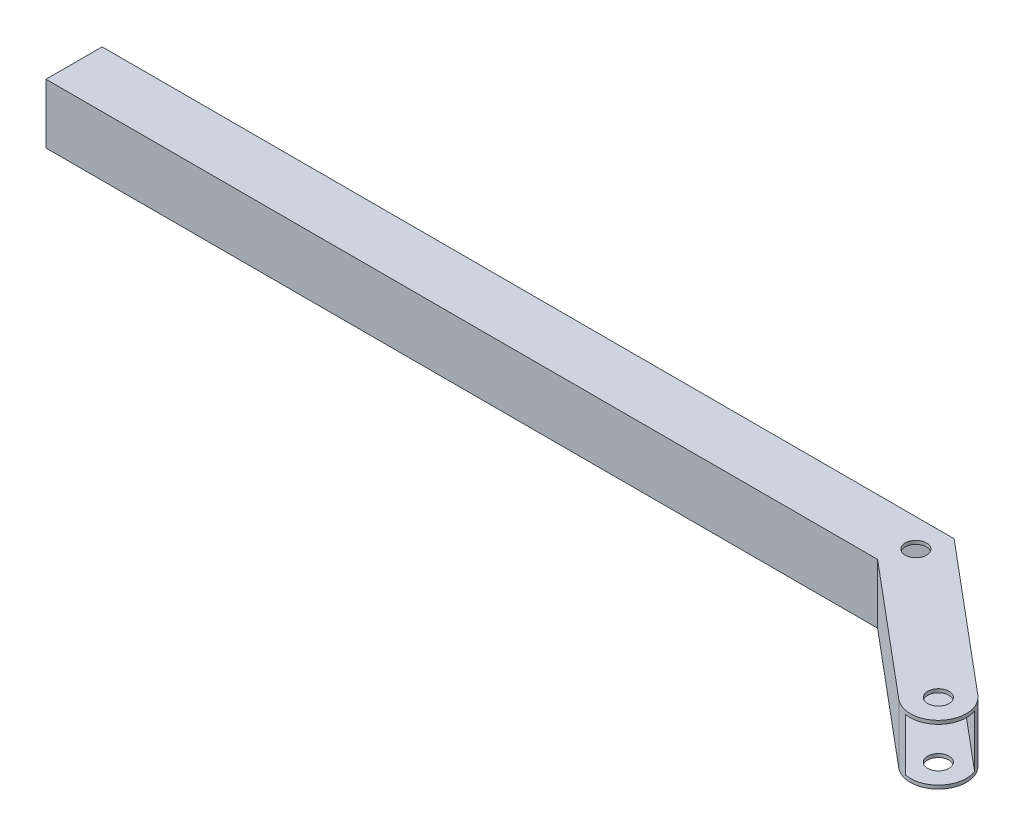
ISO-10303-21;
HEADER;
FILE_DESCRIPTION(('STEP AP214'),'2;1');
FILE_NAME('part.step','',(''),(''),'','','');
FILE_SCHEMA(('AUTOMOTIVE_DESIGN { 1 0 10303 214 1 1 1 1 }'));
ENDSEC;
DATA;
#1=APPLICATION_CONTEXT('core data for automotive mechanical design processes');
#2=APPLICATION_PROTOCOL_DEFINITION('international standard','automotive_design',2000,#1);
#3=PRODUCT_CONTEXT('',#1,'mechanical');
#4=PRODUCT('Part','Part','',(#3));
#5=PRODUCT_RELATED_PRODUCT_CATEGORY('part','',(#4));
#6=PRODUCT_DEFINITION_FORMATION('','',#4);
#7=PRODUCT_DEFINITION_CONTEXT('part definition',#1,'design');
#8=PRODUCT_DEFINITION('design','',#6,#7);
#9=PRODUCT_DEFINITION_SHAPE('','',#8);
#10=(LENGTH_UNIT() NAMED_UNIT(*) SI_UNIT(.MILLI.,.METRE.));
#11=(NAMED_UNIT(*) PLANE_ANGLE_UNIT() SI_UNIT($,.RADIAN.));
#12=(NAMED_UNIT(*) SI_UNIT($,.STERADIAN.) SOLID_ANGLE_UNIT());
#13=UNCERTAINTY_MEASURE_WITH_UNIT(LENGTH_MEASURE(1.E-05),#10,'distance_accuracy_value','');
#14=(GEOMETRIC_REPRESENTATION_CONTEXT(3) GLOBAL_UNCERTAINTY_ASSIGNED_CONTEXT((#13)) GLOBAL_UNIT_ASSIGNED_CONTEXT((#10,
#11,#12)) REPRESENTATION_CONTEXT('',''));
#15=CARTESIAN_POINT('',(0.,0.,0.));
#16=DIRECTION('',(0.,0.,1.));
#17=DIRECTION('',(1.,0.,0.));
#18=AXIS2_PLACEMENT_3D('',#15,#16,#17);
#19=CARTESIAN_POINT('',(0.,26.9875,1.58749999999997));
#20=DIRECTION('',(0.,0.,-1.));
#21=DIRECTION('',(-1.,0.,0.));
#22=AXIS2_PLACEMENT_3D('',#19,#20,#21);
#23=PLANE('',#22);
#24=DIRECTION('',(1.,0.,0.));
#25=VECTOR('',#24,1.);
#26=CARTESIAN_POINT('',(0.,25.4,1.58749999999997));
#27=LINE('',#26,#25);
#28=CARTESIAN_POINT('',(-385.622421975181,25.4,1.58749999999997));
#29=VERTEX_POINT('',#28);
#30=CARTESIAN_POINT('',(-1.33207066449406,25.4,1.58749999999997));
#31=VERTEX_POINT('',#30);
#32=EDGE_CURVE('E210',#29,#31,#27,.T.);
#33=ORIENTED_EDGE('',*,*,#32,.F.);
#34=DIRECTION('',(0.,-1.,0.));
#35=VECTOR('',#34,1.);
#36=CARTESIAN_POINT('',(-385.622421975181,26.9875,1.58749999999997));
#37=LINE('',#36,#35);
#38=CARTESIAN_POINT('',(-385.622421975181,1.5875,1.58749999999997));
#39=VERTEX_POINT('',#38);
#40=EDGE_CURVE('E224',#29,#39,#37,.T.);
#41=ORIENTED_EDGE('',*,*,#40,.T.);
#42=DIRECTION('',(1.,0.,0.));
#43=VECTOR('',#42,1.);
#44=CARTESIAN_POINT('',(0.,1.5875,1.58749999999997));
#45=LINE('',#44,#43);
#46=CARTESIAN_POINT('',(-1.33207066449406,1.5875,1.58749999999997));
#47=VERTEX_POINT('',#46);
#48=EDGE_CURVE('E360',#39,#47,#45,.T.);
#49=ORIENTED_EDGE('',*,*,#48,.T.);
#50=DIRECTION('',(0.,-1.,0.));
#51=VECTOR('',#50,1.);
#52=CARTESIAN_POINT('',(-1.33207066449406,26.9875,1.58749999999997));
#53=LINE('',#52,#51);
#54=EDGE_CURVE('E226',#31,#47,#53,.T.);
#55=ORIENTED_EDGE('',*,*,#54,.F.);
#56=EDGE_LOOP('',(#33,#41,#49,#55));
#57=FACE_BOUND('',#56,.T.);
#58=ADVANCED_FACE('F89',(#57),#23,.F.);
#59=CARTESIAN_POINT('',(0.,26.9875,0.));
#60=DIRECTION('',(-0.766044443118941,0.,-0.642787609686584));
#61=DIRECTION('',(-0.642787609686584,0.,0.766044443118941));
#62=AXIS2_PLACEMENT_3D('',#59,#60,#61);
#63=PLANE('',#62);
#64=DIRECTION('',(0.642787609686584,0.,-0.766044443118941));
#65=VECTOR('',#64,1.);
#66=CARTESIAN_POINT('',(0.,25.4,0.));
#67=LINE('',#66,#65);
#68=CARTESIAN_POINT('',(-1.02042533037727,25.4,1.21609555345134));
#69=VERTEX_POINT('',#68);
#70=EDGE_CURVE('E229',#31,#69,#67,.T.);
#71=ORIENTED_EDGE('',*,*,#70,.F.);
#72=ORIENTED_EDGE('',*,*,#54,.T.);
#73=DIRECTION('',(0.642787609686584,0.,-0.766044443118941));
#74=VECTOR('',#73,1.);
#75=CARTESIAN_POINT('',(0.,1.5875,0.));
#76=LINE('',#75,#74);
#77=CARTESIAN_POINT('',(-1.02042533037727,1.5875,1.21609555345134));
#78=VERTEX_POINT('',#77);
#79=EDGE_CURVE('E380',#47,#78,#76,.T.);
#80=ORIENTED_EDGE('',*,*,#79,.T.);
#81=DIRECTION('',(0.,-1.,0.));
#82=VECTOR('',#81,1.);
#83=CARTESIAN_POINT('',(-1.02042533037727,26.9875,1.21609555345134));
#84=LINE('',#83,#82);
#85=EDGE_CURVE('E243',#69,#78,#84,.T.);
#86=ORIENTED_EDGE('',*,*,#85,.F.);
#87=EDGE_LOOP('',(#71,#72,#80,#86));
#88=FACE_BOUND('',#87,.T.);
#89=ADVANCED_FACE('F420',(#88),#63,.F.);
#90=CARTESIAN_POINT('',(-1.02042533037771,26.9875,1.21609555345097));
#91=DIRECTION('',(0.642787609686789,0.,-0.766044443118768));
#92=DIRECTION('',(-0.766044443118769,0.,-0.642787609686789));
#93=AXIS2_PLACEMENT_3D('',#90,#91,#92);
#94=PLANE('',#93);
#95=DIRECTION('',(0.766044443118769,0.,0.642787609686789));
#96=VECTOR('',#95,1.);
#97=CARTESIAN_POINT('',(-1.02042533037771,25.4,1.21609555345097));
#98=LINE('',#97,#96);
#99=CARTESIAN_POINT('',(-0.577802746897449,25.4,1.58750000000024));
#100=VERTEX_POINT('',#99);
#101=EDGE_CURVE('E333',#69,#100,#98,.T.);
#102=ORIENTED_EDGE('',*,*,#101,.F.);
#103=ORIENTED_EDGE('',*,*,#85,.T.);
#104=DIRECTION('',(0.766044443118769,0.,0.642787609686789));
#105=VECTOR('',#104,1.);
#106=CARTESIAN_POINT('',(-1.02042533037771,1.5875,1.21609555345097));
#107=LINE('',#106,#105);
#108=CARTESIAN_POINT('',(-0.577802746897449,1.5875,1.58750000000024));
#109=VERTEX_POINT('',#108);
#110=EDGE_CURVE('E384',#78,#109,#107,.T.);
#111=ORIENTED_EDGE('',*,*,#110,.T.);
#112=DIRECTION('',(0.,-1.,0.));
#113=VECTOR('',#112,1.);
#114=CARTESIAN_POINT('',(-0.577802746897449,26.9875,1.58750000000024));
#115=LINE('',#114,#113);
#116=EDGE_CURVE('E405',#100,#109,#115,.T.);
#117=ORIENTED_EDGE('',*,*,#116,.F.);
#118=EDGE_LOOP('',(#102,#103,#111,#117));
#119=FACE_BOUND('',#118,.T.);
#120=ADVANCED_FACE('F412',(#119),#94,.F.);
#121=CARTESIAN_POINT('',(0.,26.9875,1.58750000000024));
#122=DIRECTION('',(0.,0.,-1.));
#123=DIRECTION('',(-1.,0.,0.));
#124=AXIS2_PLACEMENT_3D('',#121,#122,#123);
#125=PLANE('',#124);
#126=DIRECTION('',(1.,0.,0.));
#127=VECTOR('',#126,1.);
#128=CARTESIAN_POINT('',(0.,25.4,1.58750000000024));
#129=LINE('',#128,#127);
#130=CARTESIAN_POINT('',(-2.39507580219729E-13,25.4,1.58750000000024));
#131=VERTEX_POINT('',#130);
#132=EDGE_CURVE('E330',#100,#131,#129,.T.);
#133=ORIENTED_EDGE('',*,*,#132,.F.);
#134=ORIENTED_EDGE('',*,*,#116,.T.);
#135=DIRECTION('',(1.,0.,0.));
#136=VECTOR('',#135,1.);
#137=CARTESIAN_POINT('',(0.,1.5875,1.58750000000024));
#138=LINE('',#137,#136);
#139=CARTESIAN_POINT('',(-2.39507580219729E-13,1.5875,1.58750000000024));
#140=VERTEX_POINT('',#139);
#141=EDGE_CURVE('E388',#109,#140,#138,.T.);
#142=ORIENTED_EDGE('',*,*,#141,.T.);
#143=DIRECTION('',(0.,-1.,0.));
#144=VECTOR('',#143,1.);
#145=CARTESIAN_POINT('',(-2.39507580219729E-13,26.9875,1.58750000000024));
#146=LINE('',#145,#144);
#147=EDGE_CURVE('E402',#131,#140,#146,.T.);
#148=ORIENTED_EDGE('',*,*,#147,.F.);
#149=EDGE_LOOP('',(#133,#134,#142,#148));
#150=FACE_BOUND('',#149,.T.);
#151=ADVANCED_FACE('F425',(#150),#125,.F.);
#152=CARTESIAN_POINT('',(0.,26.9875,0.));
#153=DIRECTION('',(1.,0.,1.50870916673822E-13));
#154=DIRECTION('',(1.50870916673822E-13,0.,-1.));
#155=AXIS2_PLACEMENT_3D('',#152,#153,#154);
#156=PLANE('',#155);
#157=DIRECTION('',(-1.50870916673822E-13,0.,1.));
#158=VECTOR('',#157,1.);
#159=CARTESIAN_POINT('',(0.,25.4,0.));
#160=LINE('',#159,#158);
#161=CARTESIAN_POINT('',(-3.12683906544819E-13,25.4,2.0723340718144));
#162=VERTEX_POINT('',#161);
#163=EDGE_CURVE('E327',#131,#162,#160,.T.);
#164=ORIENTED_EDGE('',*,*,#163,.F.);
#165=ORIENTED_EDGE('',*,*,#147,.T.);
#166=DIRECTION('',(-1.50870916673822E-13,0.,1.));
#167=VECTOR('',#166,1.);
#168=CARTESIAN_POINT('',(0.,1.5875,0.));
#169=LINE('',#168,#167);
#170=CARTESIAN_POINT('',(-3.12654941069091E-13,1.5875,2.07233407181479));
#171=VERTEX_POINT('',#170);
#172=EDGE_CURVE('E392',#140,#171,#169,.T.);
#173=ORIENTED_EDGE('',*,*,#172,.T.);
#174=DIRECTION('',(0.,-1.,0.));
#175=VECTOR('',#174,1.);
#176=CARTESIAN_POINT('',(-3.12654941069091E-13,26.9875,2.07233407181479));
#177=LINE('',#176,#175);
#178=EDGE_CURVE('E115',#162,#171,#177,.T.);
#179=ORIENTED_EDGE('',*,*,#178,.F.);
#180=EDGE_LOOP('',(#164,#165,#173,#179));
#181=FACE_BOUND('',#180,.T.);
#182=ADVANCED_FACE('F427',(#181),#156,.F.);
#183=CARTESIAN_POINT('',(-1.02042533037722,26.9875,1.2160955534512));
#184=DIRECTION('',(0.642787609686534,0.,-0.766044443118982));
#185=DIRECTION('',(-0.766044443118982,0.,-0.642787609686534));
#186=AXIS2_PLACEMENT_3D('',#183,#184,#185);
#187=PLANE('',#186);
#188=DIRECTION('',(0.766044443118982,0.,0.642787609686534));
#189=VECTOR('',#188,1.);
#190=CARTESIAN_POINT('',(-1.02042533037722,25.4,1.2160955534512));
#191=LINE('',#190,#189);
#192=CARTESIAN_POINT('',(70.4674419428468,25.4,61.2015386160631));
#193=VERTEX_POINT('',#192);
#194=EDGE_CURVE('E324',#162,#193,#191,.T.);
#195=ORIENTED_EDGE('',*,*,#194,.F.);
#196=ORIENTED_EDGE('',*,*,#178,.T.);
#197=DIRECTION('',(0.766044443118982,0.,0.642787609686534));
#198=VECTOR('',#197,1.);
#199=CARTESIAN_POINT('',(-1.02042533037722,1.5875,1.2160955534512));
#200=LINE('',#199,#198);
#201=CARTESIAN_POINT('',(70.467441942847,1.5875,61.2015386160632));
#202=VERTEX_POINT('',#201);
#203=EDGE_CURVE('E365',#171,#202,#200,.T.);
#204=ORIENTED_EDGE('',*,*,#203,.T.);
#205=DIRECTION('',(0.,-1.,0.));
#206=VECTOR('',#205,1.);
#207=CARTESIAN_POINT('',(70.467441942847,26.9875,61.2015386160632));
#208=LINE('',#207,#206);
#209=EDGE_CURVE('E377',#193,#202,#208,.T.);
#210=ORIENTED_EDGE('',*,*,#209,.F.);
#211=EDGE_LOOP('',(#195,#196,#204,#210));
#212=FACE_BOUND('',#211,.T.);
#213=ADVANCED_FACE('F430',(#212),#187,.F.);
#214=CARTESIAN_POINT('',(0.,26.9875,23.8124999999998));
#215=DIRECTION('',(0.,0.,-1.));
#216=DIRECTION('',(-1.,0.,0.));
#217=AXIS2_PLACEMENT_3D('',#214,#215,#216);
#218=PLANE('',#217);
#219=DIRECTION('',(0.,-1.,0.));
#220=VECTOR('',#219,1.);
#221=CARTESIAN_POINT('',(-385.622421975181,26.9875,23.8124999999998));
#222=LINE('',#221,#220);
#223=CARTESIAN_POINT('',(-385.622421975181,25.4,23.8124999999998));
#224=VERTEX_POINT('',#223);
#225=CARTESIAN_POINT('',(-385.622421975181,1.5875,23.8124999999998));
#226=VERTEX_POINT('',#225);
#227=EDGE_CURVE('E357',#224,#226,#222,.T.);
#228=ORIENTED_EDGE('',*,*,#227,.F.);
#229=DIRECTION('',(1.,0.,0.));
#230=VECTOR('',#229,1.);
#231=CARTESIAN_POINT('',(0.,25.4,23.8124999999998));
#232=LINE('',#231,#230);
#233=CARTESIAN_POINT('',(-8.6670412034636,25.4,23.8124999999998));
#234=VERTEX_POINT('',#233);
#235=EDGE_CURVE('E213',#224,#234,#232,.T.);
#236=ORIENTED_EDGE('',*,*,#235,.T.);
#237=DIRECTION('',(0.,-1.,0.));
#238=VECTOR('',#237,1.);
#239=CARTESIAN_POINT('',(-8.6670412034636,26.9875,23.8124999999998));
#240=LINE('',#239,#238);
#241=CARTESIAN_POINT('',(-8.6670412034636,1.5875,23.8124999999998));
#242=VERTEX_POINT('',#241);
#243=EDGE_CURVE('E347',#234,#242,#240,.T.);
#244=ORIENTED_EDGE('',*,*,#243,.T.);
#245=DIRECTION('',(1.,0.,0.));
#246=VECTOR('',#245,1.);
#247=CARTESIAN_POINT('',(0.,1.5875,23.8124999999998));
#248=LINE('',#247,#246);
#249=EDGE_CURVE('E228',#226,#242,#248,.T.);
#250=ORIENTED_EDGE('',*,*,#249,.F.);
#251=EDGE_LOOP('',(#228,#236,#244,#250));
#252=FACE_BOUND('',#251,.T.);
#253=ADVANCED_FACE('F437',(#252),#218,.T.);
#254=CARTESIAN_POINT('',(-15.3063799556604,26.9875,18.2414333017705));
#255=DIRECTION('',(-0.642787609686535,0.,0.766044443118982));
#256=DIRECTION('',(0.766044443118982,0.,0.642787609686535));
#257=AXIS2_PLACEMENT_3D('',#254,#255,#256);
#258=PLANE('',#257);
#259=DIRECTION('',(-0.766044443118982,0.,-0.642787609686535));
#260=VECTOR('',#259,1.);
#261=CARTESIAN_POINT('',(-15.3063799556604,25.4,18.2414333017705));
#262=LINE('',#261,#260);
#263=CARTESIAN_POINT('',(56.1814873175643,25.4,78.2268763643829));
#264=VERTEX_POINT('',#263);
#265=EDGE_CURVE('E12',#264,#234,#262,.T.);
#266=ORIENTED_EDGE('',*,*,#265,.F.);
#267=DIRECTION('',(0.,-1.,0.));
#268=VECTOR('',#267,1.);
#269=CARTESIAN_POINT('',(56.1814873175643,26.9875,78.2268763643829));
#270=LINE('',#269,#268);
#271=CARTESIAN_POINT('',(56.1814873175642,1.5875,78.2268763643829));
#272=VERTEX_POINT('',#271);
#273=EDGE_CURVE('E107',#264,#272,#270,.T.);
#274=ORIENTED_EDGE('',*,*,#273,.T.);
#275=DIRECTION('',(-0.766044443118982,0.,-0.642787609686535));
#276=VECTOR('',#275,1.);
#277=CARTESIAN_POINT('',(-15.3063799556604,1.5875,18.2414333017705));
#278=LINE('',#277,#276);
#279=EDGE_CURVE('E343',#272,#242,#278,.T.);
#280=ORIENTED_EDGE('',*,*,#279,.T.);
#281=ORIENTED_EDGE('',*,*,#243,.F.);
#282=EDGE_LOOP('',(#266,#274,#280,#281));
#283=FACE_BOUND('',#282,.T.);
#284=ADVANCED_FACE('F434',(#283),#258,.F.);
#285=CARTESIAN_POINT('',(-385.622421975181,1.5875,0.));
#286=DIRECTION('',(1.,0.,0.));
#287=DIRECTION('',(0.,0.,-1.));
#288=AXIS2_PLACEMENT_3D('',#285,#286,#287);
#289=PLANE('',#288);
#290=ORIENTED_EDGE('',*,*,#40,.F.);
#291=DIRECTION('',(0.,0.,1.));
#292=VECTOR('',#291,1.);
#293=CARTESIAN_POINT('',(-385.622421975181,25.4,0.));
#294=LINE('',#293,#292);
#295=EDGE_CURVE('E207',#29,#224,#294,.T.);
#296=ORIENTED_EDGE('',*,*,#295,.T.);
#297=ORIENTED_EDGE('',*,*,#227,.T.);
#298=DIRECTION('',(0.,0.,1.));
#299=VECTOR('',#298,1.);
#300=CARTESIAN_POINT('',(-385.622421975181,1.5875,0.));
#301=LINE('',#300,#299);
#302=EDGE_CURVE('E234',#39,#226,#301,.T.);
#303=ORIENTED_EDGE('',*,*,#302,.F.);
#304=EDGE_LOOP('',(#290,#296,#297,#303));
#305=FACE_BOUND('',#304,.T.);
#306=DIRECTION('',(0.,-1.,0.));
#307=VECTOR('',#306,1.);
#308=CARTESIAN_POINT('',(-385.622421975181,1.5875,25.4));
#309=LINE('',#308,#307);
#310=CARTESIAN_POINT('',(-385.622421975181,26.9875,25.4));
#311=VERTEX_POINT('',#310);
#312=CARTESIAN_POINT('',(-385.622421975181,0.,25.4));
#313=VERTEX_POINT('',#312);
#314=EDGE_CURVE('E99',#311,#313,#309,.T.);
#315=ORIENTED_EDGE('',*,*,#314,.F.);
#316=DIRECTION('',(0.,0.,1.));
#317=VECTOR('',#316,1.);
#318=CARTESIAN_POINT('',(-385.622421975181,26.9875,0.));
#319=LINE('',#318,#317);
#320=CARTESIAN_POINT('',(-385.622421975181,26.9875,0.));
#321=VERTEX_POINT('',#320);
#322=EDGE_CURVE('E361',#321,#311,#319,.T.);
#323=ORIENTED_EDGE('',*,*,#322,.F.);
#324=DIRECTION('',(0.,-1.,0.));
#325=VECTOR('',#324,1.);
#326=CARTESIAN_POINT('',(-385.622421975181,1.5875,0.));
#327=LINE('',#326,#325);
#328=CARTESIAN_POINT('',(-385.622421975181,0.,0.));
#329=VERTEX_POINT('',#328);
#330=EDGE_CURVE('E253',#321,#329,#327,.T.);
#331=ORIENTED_EDGE('',*,*,#330,.T.);
#332=DIRECTION('',(0.,0.,1.));
#333=VECTOR('',#332,1.);
#334=CARTESIAN_POINT('',(-385.622421975181,0.,0.));
#335=LINE('',#334,#333);
#336=EDGE_CURVE('E236',#329,#313,#335,.T.);
#337=ORIENTED_EDGE('',*,*,#336,.T.);
#338=EDGE_LOOP('',(#315,#323,#331,#337));
#339=FACE_BOUND('',#338,.T.);
#340=ADVANCED_FACE('F91',(#305,#339),#289,.F.);
#341=CARTESIAN_POINT('',(-385.622421975181,1.5875,25.4));
#342=DIRECTION('',(0.,0.,-1.));
#343=DIRECTION('',(-1.,0.,0.));
#344=AXIS2_PLACEMENT_3D('',#341,#342,#343);
#345=PLANE('',#344);
#346=ORIENTED_EDGE('',*,*,#314,.T.);
#347=DIRECTION('',(1.,0.,0.));
#348=VECTOR('',#347,1.);
#349=CARTESIAN_POINT('',(-385.622421975181,0.,25.4));
#350=LINE('',#349,#348);
#351=CARTESIAN_POINT('',(-9.24484395036143,0.,25.4));
#352=VERTEX_POINT('',#351);
#353=EDGE_CURVE('E241',#313,#352,#350,.T.);
#354=ORIENTED_EDGE('',*,*,#353,.T.);
#355=DIRECTION('',(0.,-1.,0.));
#356=VECTOR('',#355,1.);
#357=CARTESIAN_POINT('',(-9.24484395036143,1.5875,25.4));
#358=LINE('',#357,#356);
#359=CARTESIAN_POINT('',(-9.24484395036143,26.9875,25.4));
#360=VERTEX_POINT('',#359);
#361=EDGE_CURVE('E284',#360,#352,#358,.T.);
#362=ORIENTED_EDGE('',*,*,#361,.F.);
#363=DIRECTION('',(1.,0.,0.));
#364=VECTOR('',#363,1.);
#365=CARTESIAN_POINT('',(0.,26.9875,25.4));
#366=LINE('',#365,#364);
#367=EDGE_CURVE('E338',#311,#360,#366,.T.);
#368=ORIENTED_EDGE('',*,*,#367,.F.);
#369=EDGE_LOOP('',(#346,#354,#362,#368));
#370=FACE_BOUND('',#369,.T.);
#371=ADVANCED_FACE('F476',(#370),#345,.F.);
#372=CARTESIAN_POINT('',(-9.24484395036143,1.5875,25.4));
#373=DIRECTION('',(0.642787609686534,0.,-0.766044443118982));
#374=DIRECTION('',(-0.766044443118982,0.,-0.642787609686534));
#375=AXIS2_PLACEMENT_3D('',#372,#373,#374);
#376=PLANE('',#375);
#377=ORIENTED_EDGE('',*,*,#361,.T.);
#378=DIRECTION('',(0.766044443118982,0.,0.642787609686534));
#379=VECTOR('',#378,1.);
#380=CARTESIAN_POINT('',(-9.24484395036143,0.,25.4));
#381=LINE('',#380,#379);
#382=CARTESIAN_POINT('',(50.4511441612723,0.,75.4908816072345));
#383=VERTEX_POINT('',#382);
#384=EDGE_CURVE('E258',#352,#383,#381,.T.);
#385=ORIENTED_EDGE('',*,*,#384,.T.);
#386=DIRECTION('',(0.,-1.,0.));
#387=VECTOR('',#386,1.);
#388=CARTESIAN_POINT('',(50.4511441612723,1.5875,75.4908816072345));
#389=LINE('',#388,#387);
#390=CARTESIAN_POINT('',(50.4511441612723,26.9875,75.4908816072345));
#391=VERTEX_POINT('',#390);
#392=EDGE_CURVE('E281',#391,#383,#389,.T.);
#393=ORIENTED_EDGE('',*,*,#392,.F.);
#394=DIRECTION('',(0.766044443118982,0.,0.642787609686534));
#395=VECTOR('',#394,1.);
#396=CARTESIAN_POINT('',(-16.326805286038,26.9875,19.4575288552221));
#397=LINE('',#396,#395);
#398=EDGE_CURVE('E342',#360,#391,#397,.T.);
#399=ORIENTED_EDGE('',*,*,#398,.F.);
#400=EDGE_LOOP('',(#377,#385,#393,#399));
#401=FACE_BOUND('',#400,.T.);
#402=ADVANCED_FACE('F473',(#401),#376,.F.);
#403=CARTESIAN_POINT('',(58.6145468042913,1.5875,65.7621171796234));
#404=DIRECTION('',(0.,-1.,0.));
#405=DIRECTION('',(0.,0.,-1.));
#406=AXIS2_PLACEMENT_3D('',#403,#404,#405);
#407=CYLINDRICAL_SURFACE('',#406,12.7);
#408=CARTESIAN_POINT('',(58.6145468042913,0.,65.7621171796234));
#409=DIRECTION('',(0.,1.,0.));
#410=DIRECTION('',(0.,0.,1.));
#411=AXIS2_PLACEMENT_3D('',#408,#409,#410);
#412=CIRCLE('',#411,12.7);
#413=CARTESIAN_POINT('',(66.7779494473103,0.,56.0333527520122));
#414=VERTEX_POINT('',#413);
#415=EDGE_CURVE('E262',#383,#414,#412,.T.);
#416=ORIENTED_EDGE('',*,*,#415,.T.);
#417=DIRECTION('',(0.,-1.,0.));
#418=VECTOR('',#417,1.);
#419=CARTESIAN_POINT('',(66.7779494473103,1.5875,56.0333527520122));
#420=LINE('',#419,#418);
#421=CARTESIAN_POINT('',(66.7779494473103,26.9875,56.0333527520123));
#422=VERTEX_POINT('',#421);
#423=EDGE_CURVE('E278',#422,#414,#420,.T.);
#424=ORIENTED_EDGE('',*,*,#423,.F.);
#425=CARTESIAN_POINT('',(58.6145468042913,26.9875,65.7621171796234));
#426=DIRECTION('',(0.,1.,0.));
#427=DIRECTION('',(0.,0.,1.));
#428=AXIS2_PLACEMENT_3D('',#425,#426,#427);
#429=CIRCLE('',#428,12.7);
#430=EDGE_CURVE('E364',#391,#422,#429,.T.);
#431=ORIENTED_EDGE('',*,*,#430,.F.);
#432=ORIENTED_EDGE('',*,*,#392,.T.);
#433=EDGE_LOOP('',(#416,#424,#431,#432));
#434=FACE_BOUND('',#433,.T.);
#435=CARTESIAN_POINT('',(58.6145468042912,25.4,65.7621171796234));
#436=DIRECTION('',(0.,1.,0.));
#437=DIRECTION('',(0.,0.,1.));
#438=AXIS2_PLACEMENT_3D('',#435,#436,#437);
#439=CIRCLE('',#438,12.7);
#440=EDGE_CURVE('E218',#264,#193,#439,.T.);
#441=ORIENTED_EDGE('',*,*,#440,.T.);
#442=ORIENTED_EDGE('',*,*,#209,.T.);
#443=CARTESIAN_POINT('',(58.6145468042913,1.5875,65.7621171796234));
#444=DIRECTION('',(0.,1.,0.));
#445=DIRECTION('',(0.,0.,1.));
#446=AXIS2_PLACEMENT_3D('',#443,#444,#445);
#447=CIRCLE('',#446,12.7);
#448=EDGE_CURVE('E249',#272,#202,#447,.T.);
#449=ORIENTED_EDGE('',*,*,#448,.F.);
#450=ORIENTED_EDGE('',*,*,#273,.F.);
#451=EDGE_LOOP('',(#441,#442,#449,#450));
#452=FACE_BOUND('',#451,.T.);
#453=ADVANCED_FACE('F432',(#434,#452),#407,.T.);
#454=CARTESIAN_POINT('',(66.7779494473103,1.5875,56.0333527520122));
#455=DIRECTION('',(-0.642787609686533,0.,0.766044443118983));
#456=DIRECTION('',(0.766044443118983,0.,0.642787609686533));
#457=AXIS2_PLACEMENT_3D('',#454,#455,#456);
#458=PLANE('',#457);
#459=ORIENTED_EDGE('',*,*,#423,.T.);
#460=DIRECTION('',(-0.766044443118983,0.,-0.642787609686533));
#461=VECTOR('',#460,1.);
#462=CARTESIAN_POINT('',(66.7779494473103,0.,56.0333527520122));
#463=LINE('',#462,#461);
#464=CARTESIAN_POINT('',(0.,0.,0.));
#465=VERTEX_POINT('',#464);
#466=EDGE_CURVE('E266',#414,#465,#463,.T.);
#467=ORIENTED_EDGE('',*,*,#466,.T.);
#468=DIRECTION('',(0.,-1.,0.));
#469=VECTOR('',#468,1.);
#470=CARTESIAN_POINT('',(0.,1.5875,0.));
#471=LINE('',#470,#469);
#472=CARTESIAN_POINT('',(0.,26.9875,0.));
#473=VERTEX_POINT('',#472);
#474=EDGE_CURVE('E275',#473,#465,#471,.T.);
#475=ORIENTED_EDGE('',*,*,#474,.F.);
#476=DIRECTION('',(-0.766044443118983,0.,-0.642787609686533));
#477=VECTOR('',#476,1.);
#478=CARTESIAN_POINT('',(0.,26.9875,0.));
#479=LINE('',#478,#477);
#480=EDGE_CURVE('E369',#422,#473,#479,.T.);
#481=ORIENTED_EDGE('',*,*,#480,.F.);
#482=EDGE_LOOP('',(#459,#467,#475,#481));
#483=FACE_BOUND('',#482,.T.);
#484=ADVANCED_FACE('F466',(#483),#458,.F.);
#485=CARTESIAN_POINT('',(0.,1.5875,0.));
#486=DIRECTION('',(0.,0.,1.));
#487=DIRECTION('',(1.,0.,0.));
#488=AXIS2_PLACEMENT_3D('',#485,#486,#487);
#489=PLANE('',#488);
#490=ORIENTED_EDGE('',*,*,#474,.T.);
#491=DIRECTION('',(-1.,0.,0.));
#492=VECTOR('',#491,1.);
#493=CARTESIAN_POINT('',(0.,0.,0.));
#494=LINE('',#493,#492);
#495=EDGE_CURVE('E250',#465,#329,#494,.T.);
#496=ORIENTED_EDGE('',*,*,#495,.T.);
#497=ORIENTED_EDGE('',*,*,#330,.F.);
#498=DIRECTION('',(-1.,0.,0.));
#499=VECTOR('',#498,1.);
#500=CARTESIAN_POINT('',(0.,26.9875,0.));
#501=LINE('',#500,#499);
#502=EDGE_CURVE('E373',#473,#321,#501,.T.);
#503=ORIENTED_EDGE('',*,*,#502,.F.);
#504=EDGE_LOOP('',(#490,#496,#497,#503));
#505=FACE_BOUND('',#504,.T.);
#506=ADVANCED_FACE('F458',(#505),#489,.F.);
#507=CARTESIAN_POINT('',(58.6145468042913,1.5875,65.7621171796234));
#508=DIRECTION('',(0.,1.,0.));
#509=DIRECTION('',(0.,0.,1.));
#510=AXIS2_PLACEMENT_3D('',#507,#508,#509);
#511=PLANE('',#510);
#512=CARTESIAN_POINT('',(58.6145468042913,1.5875,65.7621171796234));
#513=DIRECTION('',(0.,1.,0.));
#514=DIRECTION('',(0.,0.,1.));
#515=AXIS2_PLACEMENT_3D('',#512,#513,#514);
#516=CIRCLE('',#515,4.826);
#517=CARTESIAN_POINT('',(58.6145468042913,1.5875,70.5881171796234));
#518=VERTEX_POINT('',#517);
#519=EDGE_CURVE('E219',#518,#518,#516,.T.);
#520=ORIENTED_EDGE('',*,*,#519,.F.);
#521=EDGE_LOOP('',(#520));
#522=FACE_BOUND('',#521,.T.);
#523=CARTESIAN_POINT('',(-4.62242197518072,1.5875,12.7));
#524=DIRECTION('',(0.,1.,0.));
#525=DIRECTION('',(0.,0.,1.));
#526=AXIS2_PLACEMENT_3D('',#523,#524,#525);
#527=CIRCLE('',#526,4.826);
#528=CARTESIAN_POINT('',(-4.62242197518072,1.5875,17.526));
#529=VERTEX_POINT('',#528);
#530=EDGE_CURVE('E298',#529,#529,#527,.T.);
#531=ORIENTED_EDGE('',*,*,#530,.F.);
#532=EDGE_LOOP('',(#531));
#533=FACE_BOUND('',#532,.T.);
#534=ORIENTED_EDGE('',*,*,#249,.T.);
#535=ORIENTED_EDGE('',*,*,#279,.F.);
#536=ORIENTED_EDGE('',*,*,#448,.T.);
#537=ORIENTED_EDGE('',*,*,#203,.F.);
#538=ORIENTED_EDGE('',*,*,#172,.F.);
#539=ORIENTED_EDGE('',*,*,#141,.F.);
#540=ORIENTED_EDGE('',*,*,#110,.F.);
#541=ORIENTED_EDGE('',*,*,#79,.F.);
#542=ORIENTED_EDGE('',*,*,#48,.F.);
#543=ORIENTED_EDGE('',*,*,#302,.T.);
#544=EDGE_LOOP('',(#534,#535,#536,#537,#538,#539,#540,#541,#542,#543));
#545=FACE_BOUND('',#544,.T.);
#546=ADVANCED_FACE('F418',(#522,#533,#545),#511,.T.);
#547=CARTESIAN_POINT('',(58.6145468042913,0.,65.7621171796234));
#548=DIRECTION('',(0.,1.,0.));
#549=DIRECTION('',(0.,0.,1.));
#550=AXIS2_PLACEMENT_3D('',#547,#548,#549);
#551=PLANE('',#550);
#552=CARTESIAN_POINT('',(58.6145468042913,0.,65.7621171796234));
#553=DIRECTION('',(0.,1.,0.));
#554=DIRECTION('',(0.,0.,1.));
#555=AXIS2_PLACEMENT_3D('',#552,#553,#554);
#556=CIRCLE('',#555,4.826);
#557=CARTESIAN_POINT('',(58.6145468042913,0.,70.5881171796234));
#558=VERTEX_POINT('',#557);
#559=EDGE_CURVE('E312',#558,#558,#556,.T.);
#560=ORIENTED_EDGE('',*,*,#559,.T.);
#561=EDGE_LOOP('',(#560));
#562=FACE_BOUND('',#561,.T.);
#563=CARTESIAN_POINT('',(-4.62242197518072,0.,12.7));
#564=DIRECTION('',(0.,1.,0.));
#565=DIRECTION('',(0.,0.,1.));
#566=AXIS2_PLACEMENT_3D('',#563,#564,#565);
#567=CIRCLE('',#566,4.826);
#568=CARTESIAN_POINT('',(-4.62242197518072,0.,17.526));
#569=VERTEX_POINT('',#568);
#570=EDGE_CURVE('E291',#569,#569,#567,.T.);
#571=ORIENTED_EDGE('',*,*,#570,.T.);
#572=EDGE_LOOP('',(#571));
#573=FACE_BOUND('',#572,.T.);
#574=ORIENTED_EDGE('',*,*,#336,.F.);
#575=ORIENTED_EDGE('',*,*,#495,.F.);
#576=ORIENTED_EDGE('',*,*,#466,.F.);
#577=ORIENTED_EDGE('',*,*,#415,.F.);
#578=ORIENTED_EDGE('',*,*,#384,.F.);
#579=ORIENTED_EDGE('',*,*,#353,.F.);
#580=EDGE_LOOP('',(#574,#575,#576,#577,#578,#579));
#581=FACE_BOUND('',#580,.T.);
#582=ADVANCED_FACE('F457',(#562,#573,#581),#551,.F.);
#583=CARTESIAN_POINT('',(0.,26.9875,0.));
#584=DIRECTION('',(0.,1.,0.));
#585=DIRECTION('',(0.,0.,1.));
#586=AXIS2_PLACEMENT_3D('',#583,#584,#585);
#587=PLANE('',#586);
#588=CARTESIAN_POINT('',(58.6145468042913,26.9875,65.7621171796234));
#589=DIRECTION('',(0.,1.,0.));
#590=DIRECTION('',(0.,0.,1.));
#591=AXIS2_PLACEMENT_3D('',#588,#589,#590);
#592=CIRCLE('',#591,4.826);
#593=CARTESIAN_POINT('',(58.6145468042913,26.9875,70.5881171796234));
#594=VERTEX_POINT('',#593);
#595=EDGE_CURVE('E292',#594,#594,#592,.T.);
#596=ORIENTED_EDGE('',*,*,#595,.F.);
#597=EDGE_LOOP('',(#596));
#598=FACE_BOUND('',#597,.T.);
#599=CARTESIAN_POINT('',(-4.62242197518072,26.9875,12.7));
#600=DIRECTION('',(0.,1.,0.));
#601=DIRECTION('',(0.,0.,1.));
#602=AXIS2_PLACEMENT_3D('',#599,#600,#601);
#603=CIRCLE('',#602,4.826);
#604=CARTESIAN_POINT('',(-4.62242197518072,26.9875,17.526));
#605=VERTEX_POINT('',#604);
#606=EDGE_CURVE('E301',#605,#605,#603,.T.);
#607=ORIENTED_EDGE('',*,*,#606,.F.);
#608=EDGE_LOOP('',(#607));
#609=FACE_BOUND('',#608,.T.);
#610=ORIENTED_EDGE('',*,*,#322,.T.);
#611=ORIENTED_EDGE('',*,*,#367,.T.);
#612=ORIENTED_EDGE('',*,*,#398,.T.);
#613=ORIENTED_EDGE('',*,*,#430,.T.);
#614=ORIENTED_EDGE('',*,*,#480,.T.);
#615=ORIENTED_EDGE('',*,*,#502,.T.);
#616=EDGE_LOOP('',(#610,#611,#612,#613,#614,#615));
#617=FACE_BOUND('',#616,.T.);
#618=ADVANCED_FACE('F462',(#598,#609,#617),#587,.T.);
#619=CARTESIAN_POINT('',(58.6145468042912,25.4,65.7621171796234));
#620=DIRECTION('',(0.,1.,0.));
#621=DIRECTION('',(0.,0.,1.));
#622=AXIS2_PLACEMENT_3D('',#619,#620,#621);
#623=PLANE('',#622);
#624=CARTESIAN_POINT('',(58.6145468042913,25.4,65.7621171796234));
#625=DIRECTION('',(0.,1.,0.));
#626=DIRECTION('',(0.,0.,1.));
#627=AXIS2_PLACEMENT_3D('',#624,#625,#626);
#628=CIRCLE('',#627,4.826);
#629=CARTESIAN_POINT('',(58.6145468042913,25.4,70.5881171796234));
#630=VERTEX_POINT('',#629);
#631=EDGE_CURVE('E93',#630,#630,#628,.T.);
#632=ORIENTED_EDGE('',*,*,#631,.T.);
#633=EDGE_LOOP('',(#632));
#634=FACE_BOUND('',#633,.T.);
#635=CARTESIAN_POINT('',(-4.62242197518072,25.4,12.7));
#636=DIRECTION('',(0.,1.,0.));
#637=DIRECTION('',(0.,0.,1.));
#638=AXIS2_PLACEMENT_3D('',#635,#636,#637);
#639=CIRCLE('',#638,4.826);
#640=CARTESIAN_POINT('',(-4.62242197518072,25.4,17.526));
#641=VERTEX_POINT('',#640);
#642=EDGE_CURVE('E288',#641,#641,#639,.T.);
#643=ORIENTED_EDGE('',*,*,#642,.T.);
#644=EDGE_LOOP('',(#643));
#645=FACE_BOUND('',#644,.T.);
#646=ORIENTED_EDGE('',*,*,#295,.F.);
#647=ORIENTED_EDGE('',*,*,#32,.T.);
#648=ORIENTED_EDGE('',*,*,#70,.T.);
#649=ORIENTED_EDGE('',*,*,#101,.T.);
#650=ORIENTED_EDGE('',*,*,#132,.T.);
#651=ORIENTED_EDGE('',*,*,#163,.T.);
#652=ORIENTED_EDGE('',*,*,#194,.T.);
#653=ORIENTED_EDGE('',*,*,#440,.F.);
#654=ORIENTED_EDGE('',*,*,#265,.T.);
#655=ORIENTED_EDGE('',*,*,#235,.F.);
#656=EDGE_LOOP('',(#646,#647,#648,#649,#650,#651,#652,#653,#654,#655));
#657=FACE_BOUND('',#656,.T.);
#658=ADVANCED_FACE('F209',(#634,#645,#657),#623,.F.);
#659=CARTESIAN_POINT('',(-4.62242197518072,-28.956,12.7));
#660=DIRECTION('',(0.,1.,0.));
#661=DIRECTION('',(0.,0.,1.));
#662=AXIS2_PLACEMENT_3D('',#659,#660,#661);
#663=CYLINDRICAL_SURFACE('',#662,4.826);
#664=ORIENTED_EDGE('',*,*,#606,.T.);
#665=EDGE_LOOP('',(#664));
#666=FACE_BOUND('',#665,.T.);
#667=ORIENTED_EDGE('',*,*,#642,.F.);
#668=EDGE_LOOP('',(#667));
#669=FACE_BOUND('',#668,.T.);
#670=ADVANCED_FACE('F503',(#666,#669),#663,.F.);
#671=CARTESIAN_POINT('',(58.6145468042913,-28.956,65.7621171796234));
#672=DIRECTION('',(0.,1.,0.));
#673=DIRECTION('',(0.,0.,1.));
#674=AXIS2_PLACEMENT_3D('',#671,#672,#673);
#675=CYLINDRICAL_SURFACE('',#674,4.826);
#676=ORIENTED_EDGE('',*,*,#595,.T.);
#677=EDGE_LOOP('',(#676));
#678=FACE_BOUND('',#677,.T.);
#679=ORIENTED_EDGE('',*,*,#631,.F.);
#680=EDGE_LOOP('',(#679));
#681=FACE_BOUND('',#680,.T.);
#682=ADVANCED_FACE('F614',(#678,#681),#675,.F.);
#683=ORIENTED_EDGE('',*,*,#530,.T.);
#684=EDGE_LOOP('',(#683));
#685=FACE_BOUND('',#684,.T.);
#686=ORIENTED_EDGE('',*,*,#570,.F.);
#687=EDGE_LOOP('',(#686));
#688=FACE_BOUND('',#687,.T.);
#689=ADVANCED_FACE('F617',(#685,#688),#663,.F.);
#690=ORIENTED_EDGE('',*,*,#519,.T.);
#691=EDGE_LOOP('',(#690));
#692=FACE_BOUND('',#691,.T.);
#693=ORIENTED_EDGE('',*,*,#559,.F.);
#694=EDGE_LOOP('',(#693));
#695=FACE_BOUND('',#694,.T.);
#696=ADVANCED_FACE('F626',(#692,#695),#675,.F.);
#697=CLOSED_SHELL('',(#58,#89,#120,#151,#182,#213,#253,#284,#340,#371,#402,#453,#484,#506,#546,
#582,#618,#658,#670,#682,#689,#696));
#698=MANIFOLD_SOLID_BREP('B2',#697);
#699=ADVANCED_BREP_SHAPE_REPRESENTATION('',(#18,#698),#14);
#700=SHAPE_DEFINITION_REPRESENTATION(#9,#699);
ENDSEC;
END-ISO-10303-21;
